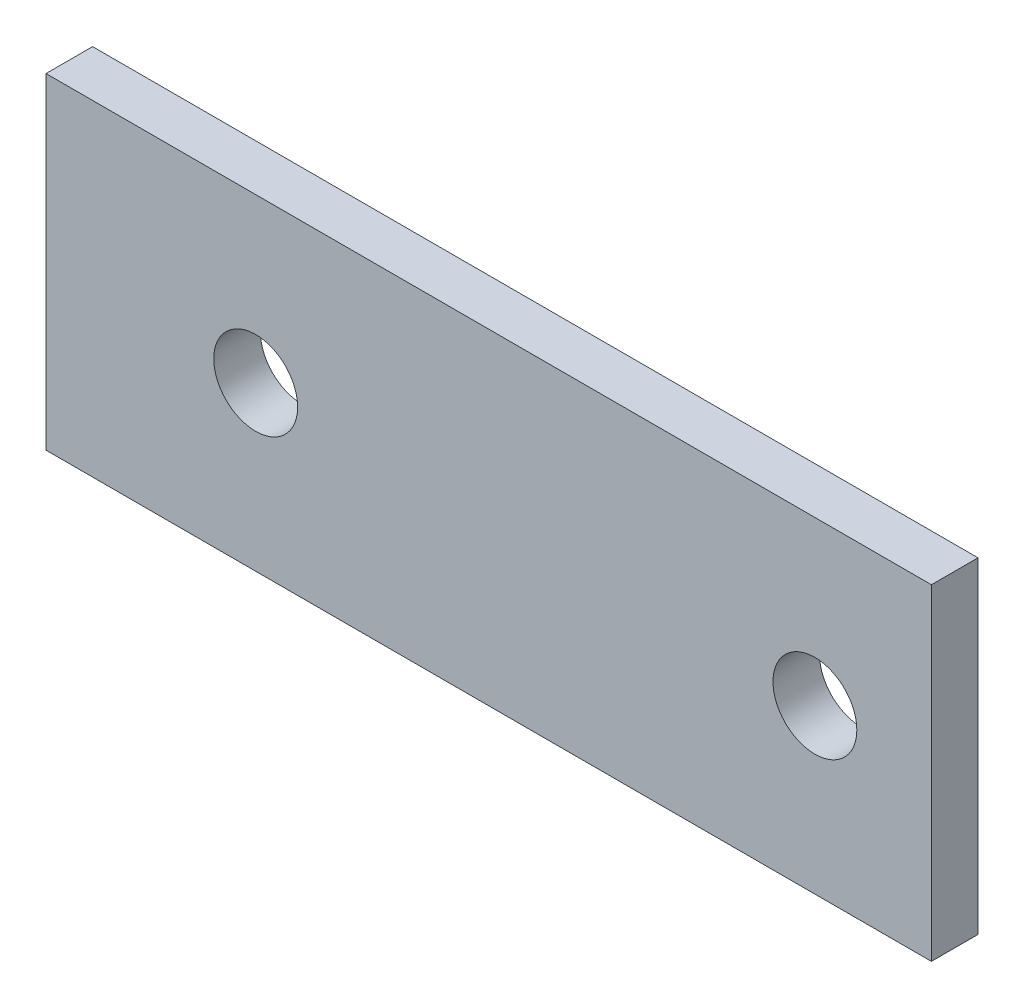
ISO-10303-21;
HEADER;
FILE_DESCRIPTION(('STEP AP214'),'2;1');
FILE_NAME('part.step','',(''),(''),'','','');
FILE_SCHEMA(('AUTOMOTIVE_DESIGN { 1 0 10303 214 1 1 1 1 }'));
ENDSEC;
DATA;
#1=APPLICATION_CONTEXT('core data for automotive mechanical design processes');
#2=APPLICATION_PROTOCOL_DEFINITION('international standard','automotive_design',2000,#1);
#3=PRODUCT_CONTEXT('',#1,'mechanical');
#4=PRODUCT('Part','Part','',(#3));
#5=PRODUCT_RELATED_PRODUCT_CATEGORY('part','',(#4));
#6=PRODUCT_DEFINITION_FORMATION('','',#4);
#7=PRODUCT_DEFINITION_CONTEXT('part definition',#1,'design');
#8=PRODUCT_DEFINITION('design','',#6,#7);
#9=PRODUCT_DEFINITION_SHAPE('','',#8);
#10=(LENGTH_UNIT() NAMED_UNIT(*) SI_UNIT(.MILLI.,.METRE.));
#11=(NAMED_UNIT(*) PLANE_ANGLE_UNIT() SI_UNIT($,.RADIAN.));
#12=(NAMED_UNIT(*) SI_UNIT($,.STERADIAN.) SOLID_ANGLE_UNIT());
#13=UNCERTAINTY_MEASURE_WITH_UNIT(LENGTH_MEASURE(1.E-05),#10,'distance_accuracy_value','');
#14=(GEOMETRIC_REPRESENTATION_CONTEXT(3) GLOBAL_UNCERTAINTY_ASSIGNED_CONTEXT((#13)) GLOBAL_UNIT_ASSIGNED_CONTEXT((#10,
#11,#12)) REPRESENTATION_CONTEXT('',''));
#15=CARTESIAN_POINT('',(0.,0.,0.));
#16=DIRECTION('',(0.,0.,1.));
#17=DIRECTION('',(1.,0.,0.));
#18=AXIS2_PLACEMENT_3D('',#15,#16,#17);
#19=CARTESIAN_POINT('',(0.,0.,5.));
#20=DIRECTION('',(0.,0.,1.));
#21=DIRECTION('',(1.,0.,0.));
#22=AXIS2_PLACEMENT_3D('',#19,#20,#21);
#23=PLANE('',#22);
#24=CARTESIAN_POINT('',(70.,0.,5.));
#25=DIRECTION('',(0.,0.,1.));
#26=DIRECTION('',(1.,0.,0.));
#27=AXIS2_PLACEMENT_3D('',#24,#25,#26);
#28=CIRCLE('',#27,9.);
#29=CARTESIAN_POINT('',(79.,0.,5.));
#30=VERTEX_POINT('',#29);
#31=EDGE_CURVE('E108',#30,#30,#28,.T.);
#32=ORIENTED_EDGE('',*,*,#31,.F.);
#33=EDGE_LOOP('',(#32));
#34=FACE_BOUND('',#33,.T.);
#35=DIRECTION('',(0.,1.,0.));
#36=VECTOR('',#35,1.);
#37=CARTESIAN_POINT('',(94.9999999999994,35.,5.));
#38=LINE('',#37,#36);
#39=CARTESIAN_POINT('',(95.,-35.,5.));
#40=VERTEX_POINT('',#39);
#41=CARTESIAN_POINT('',(94.9999999999994,35.,5.));
#42=VERTEX_POINT('',#41);
#43=EDGE_CURVE('E87',#40,#42,#38,.T.);
#44=ORIENTED_EDGE('',*,*,#43,.T.);
#45=DIRECTION('',(-1.,0.,0.));
#46=VECTOR('',#45,1.);
#47=CARTESIAN_POINT('',(-95.0000000000003,35.,5.00000000000032));
#48=LINE('',#47,#46);
#49=CARTESIAN_POINT('',(-95.0000000000003,35.,5.00000000000032));
#50=VERTEX_POINT('',#49);
#51=EDGE_CURVE('E82',#42,#50,#48,.T.);
#52=ORIENTED_EDGE('',*,*,#51,.T.);
#53=DIRECTION('',(0.,-1.,0.));
#54=VECTOR('',#53,1.);
#55=CARTESIAN_POINT('',(-95.0000000000003,35.,5.00000000000032));
#56=LINE('',#55,#54);
#57=CARTESIAN_POINT('',(-95.,-35.,5.00000000000032));
#58=VERTEX_POINT('',#57);
#59=EDGE_CURVE('E85',#50,#58,#56,.T.);
#60=ORIENTED_EDGE('',*,*,#59,.T.);
#61=DIRECTION('',(1.,0.,0.));
#62=VECTOR('',#61,1.);
#63=CARTESIAN_POINT('',(-95.,-35.,5.00000000000032));
#64=LINE('',#63,#62);
#65=EDGE_CURVE('E52',#58,#40,#64,.T.);
#66=ORIENTED_EDGE('',*,*,#65,.T.);
#67=EDGE_LOOP('',(#44,#52,#60,#66));
#68=FACE_BOUND('',#67,.T.);
#69=CARTESIAN_POINT('',(-50.,0.,5.00000000000031));
#70=DIRECTION('',(0.,0.,1.));
#71=DIRECTION('',(1.,0.,0.));
#72=AXIS2_PLACEMENT_3D('',#69,#70,#71);
#73=CIRCLE('',#72,9.);
#74=CARTESIAN_POINT('',(-41.,0.,5.00000000000031));
#75=VERTEX_POINT('',#74);
#76=EDGE_CURVE('E132',#75,#75,#73,.T.);
#77=ORIENTED_EDGE('',*,*,#76,.F.);
#78=EDGE_LOOP('',(#77));
#79=FACE_BOUND('',#78,.T.);
#80=ADVANCED_FACE('F34',(#34,#68,#79),#23,.T.);
#81=CARTESIAN_POINT('',(0.,0.,-5.));
#82=DIRECTION('',(0.,0.,1.));
#83=DIRECTION('',(1.,0.,0.));
#84=AXIS2_PLACEMENT_3D('',#81,#82,#83);
#85=PLANE('',#84);
#86=DIRECTION('',(0.,1.,0.));
#87=VECTOR('',#86,1.);
#88=CARTESIAN_POINT('',(95.,35.,-5.));
#89=LINE('',#88,#87);
#90=CARTESIAN_POINT('',(95.0000000000007,-35.,-5.));
#91=VERTEX_POINT('',#90);
#92=CARTESIAN_POINT('',(95.,35.,-5.));
#93=VERTEX_POINT('',#92);
#94=EDGE_CURVE('E104',#91,#93,#89,.T.);
#95=ORIENTED_EDGE('',*,*,#94,.F.);
#96=DIRECTION('',(1.,0.,0.));
#97=VECTOR('',#96,1.);
#98=CARTESIAN_POINT('',(-95.,-35.,-4.99999999999969));
#99=LINE('',#98,#97);
#100=CARTESIAN_POINT('',(-95.,-35.,-4.99999999999969));
#101=VERTEX_POINT('',#100);
#102=EDGE_CURVE('E75',#101,#91,#99,.T.);
#103=ORIENTED_EDGE('',*,*,#102,.F.);
#104=DIRECTION('',(0.,-1.,0.));
#105=VECTOR('',#104,1.);
#106=CARTESIAN_POINT('',(-95.,35.,-4.99999999999969));
#107=LINE('',#106,#105);
#108=CARTESIAN_POINT('',(-95.,35.,-4.99999999999969));
#109=VERTEX_POINT('',#108);
#110=EDGE_CURVE('E69',#109,#101,#107,.T.);
#111=ORIENTED_EDGE('',*,*,#110,.F.);
#112=DIRECTION('',(-1.,0.,0.));
#113=VECTOR('',#112,1.);
#114=CARTESIAN_POINT('',(-95.,35.,-4.99999999999969));
#115=LINE('',#114,#113);
#116=EDGE_CURVE('E92',#93,#109,#115,.T.);
#117=ORIENTED_EDGE('',*,*,#116,.F.);
#118=EDGE_LOOP('',(#95,#103,#111,#117));
#119=FACE_BOUND('',#118,.T.);
#120=CARTESIAN_POINT('',(70.,0.,-4.99999999999999));
#121=DIRECTION('',(0.,0.,1.));
#122=DIRECTION('',(1.,0.,0.));
#123=AXIS2_PLACEMENT_3D('',#120,#121,#122);
#124=CIRCLE('',#123,9.);
#125=CARTESIAN_POINT('',(79.,0.,-4.99999999999999));
#126=VERTEX_POINT('',#125);
#127=EDGE_CURVE('E128',#126,#126,#124,.T.);
#128=ORIENTED_EDGE('',*,*,#127,.T.);
#129=EDGE_LOOP('',(#128));
#130=FACE_BOUND('',#129,.T.);
#131=CARTESIAN_POINT('',(-50.0000000000001,0.,-4.99999999999969));
#132=DIRECTION('',(0.,0.,1.));
#133=DIRECTION('',(1.,0.,0.));
#134=AXIS2_PLACEMENT_3D('',#131,#132,#133);
#135=CIRCLE('',#134,9.);
#136=CARTESIAN_POINT('',(-41.0000000000001,0.,-4.99999999999969));
#137=VERTEX_POINT('',#136);
#138=EDGE_CURVE('E136',#137,#137,#135,.T.);
#139=ORIENTED_EDGE('',*,*,#138,.T.);
#140=EDGE_LOOP('',(#139));
#141=FACE_BOUND('',#140,.T.);
#142=ADVANCED_FACE('F122',(#119,#130,#141),#85,.F.);
#143=CARTESIAN_POINT('',(94.9999999999994,35.,5.));
#144=DIRECTION('',(-1.,0.,0.));
#145=DIRECTION('',(0.,0.,1.));
#146=AXIS2_PLACEMENT_3D('',#143,#144,#145);
#147=PLANE('',#146);
#148=ORIENTED_EDGE('',*,*,#94,.T.);
#149=DIRECTION('',(0.,0.,-1.));
#150=VECTOR('',#149,1.);
#151=CARTESIAN_POINT('',(94.9999999999994,35.,5.));
#152=LINE('',#151,#150);
#153=EDGE_CURVE('E11',#42,#93,#152,.T.);
#154=ORIENTED_EDGE('',*,*,#153,.F.);
#155=ORIENTED_EDGE('',*,*,#43,.F.);
#156=DIRECTION('',(0.,0.,-1.));
#157=VECTOR('',#156,1.);
#158=CARTESIAN_POINT('',(95.,-35.,5.));
#159=LINE('',#158,#157);
#160=EDGE_CURVE('E100',#40,#91,#159,.T.);
#161=ORIENTED_EDGE('',*,*,#160,.T.);
#162=EDGE_LOOP('',(#148,#154,#155,#161));
#163=FACE_BOUND('',#162,.T.);
#164=ADVANCED_FACE('F36',(#163),#147,.F.);
#165=CARTESIAN_POINT('',(-95.0000000000003,35.,5.00000000000032));
#166=DIRECTION('',(0.,-1.,0.));
#167=DIRECTION('',(0.,0.,-1.));
#168=AXIS2_PLACEMENT_3D('',#165,#166,#167);
#169=PLANE('',#168);
#170=ORIENTED_EDGE('',*,*,#116,.T.);
#171=DIRECTION('',(0.,0.,-1.));
#172=VECTOR('',#171,1.);
#173=CARTESIAN_POINT('',(-95.0000000000003,35.,5.00000000000032));
#174=LINE('',#173,#172);
#175=EDGE_CURVE('E44',#50,#109,#174,.T.);
#176=ORIENTED_EDGE('',*,*,#175,.F.);
#177=ORIENTED_EDGE('',*,*,#51,.F.);
#178=ORIENTED_EDGE('',*,*,#153,.T.);
#179=EDGE_LOOP('',(#170,#176,#177,#178));
#180=FACE_BOUND('',#179,.T.);
#181=ADVANCED_FACE('F91',(#180),#169,.F.);
#182=CARTESIAN_POINT('',(-95.0000000000003,35.,5.00000000000032));
#183=DIRECTION('',(1.,0.,0.));
#184=DIRECTION('',(0.,0.,-1.));
#185=AXIS2_PLACEMENT_3D('',#182,#183,#184);
#186=PLANE('',#185);
#187=ORIENTED_EDGE('',*,*,#110,.T.);
#188=DIRECTION('',(0.,0.,-1.));
#189=VECTOR('',#188,1.);
#190=CARTESIAN_POINT('',(-95.,-35.,5.00000000000032));
#191=LINE('',#190,#189);
#192=EDGE_CURVE('E94',#58,#101,#191,.T.);
#193=ORIENTED_EDGE('',*,*,#192,.F.);
#194=ORIENTED_EDGE('',*,*,#59,.F.);
#195=ORIENTED_EDGE('',*,*,#175,.T.);
#196=EDGE_LOOP('',(#187,#193,#194,#195));
#197=FACE_BOUND('',#196,.T.);
#198=ADVANCED_FACE('F95',(#197),#186,.F.);
#199=CARTESIAN_POINT('',(-95.,-35.,5.00000000000032));
#200=DIRECTION('',(0.,1.,0.));
#201=DIRECTION('',(0.,0.,1.));
#202=AXIS2_PLACEMENT_3D('',#199,#200,#201);
#203=PLANE('',#202);
#204=ORIENTED_EDGE('',*,*,#102,.T.);
#205=ORIENTED_EDGE('',*,*,#160,.F.);
#206=ORIENTED_EDGE('',*,*,#65,.F.);
#207=ORIENTED_EDGE('',*,*,#192,.T.);
#208=EDGE_LOOP('',(#204,#205,#206,#207));
#209=FACE_BOUND('',#208,.T.);
#210=ADVANCED_FACE('F119',(#209),#203,.F.);
#211=CARTESIAN_POINT('',(70.,0.,5.));
#212=DIRECTION('',(0.,0.,-1.));
#213=DIRECTION('',(-1.,0.,0.));
#214=AXIS2_PLACEMENT_3D('',#211,#212,#213);
#215=CYLINDRICAL_SURFACE('',#214,9.);
#216=ORIENTED_EDGE('',*,*,#31,.T.);
#217=EDGE_LOOP('',(#216));
#218=FACE_BOUND('',#217,.T.);
#219=ORIENTED_EDGE('',*,*,#127,.F.);
#220=EDGE_LOOP('',(#219));
#221=FACE_BOUND('',#220,.T.);
#222=ADVANCED_FACE('F156',(#218,#221),#215,.F.);
#223=CARTESIAN_POINT('',(-50.,0.,5.00000000000031));
#224=DIRECTION('',(0.,0.,-1.));
#225=DIRECTION('',(-1.,0.,0.));
#226=AXIS2_PLACEMENT_3D('',#223,#224,#225);
#227=CYLINDRICAL_SURFACE('',#226,9.);
#228=ORIENTED_EDGE('',*,*,#76,.T.);
#229=EDGE_LOOP('',(#228));
#230=FACE_BOUND('',#229,.T.);
#231=ORIENTED_EDGE('',*,*,#138,.F.);
#232=EDGE_LOOP('',(#231));
#233=FACE_BOUND('',#232,.T.);
#234=ADVANCED_FACE('F145',(#230,#233),#227,.F.);
#235=CLOSED_SHELL('',(#80,#142,#164,#181,#198,#210,#222,#234));
#236=MANIFOLD_SOLID_BREP('B2',#235);
#237=ADVANCED_BREP_SHAPE_REPRESENTATION('',(#18,#236),#14);
#238=SHAPE_DEFINITION_REPRESENTATION(#9,#237);
ENDSEC;
END-ISO-10303-21;
